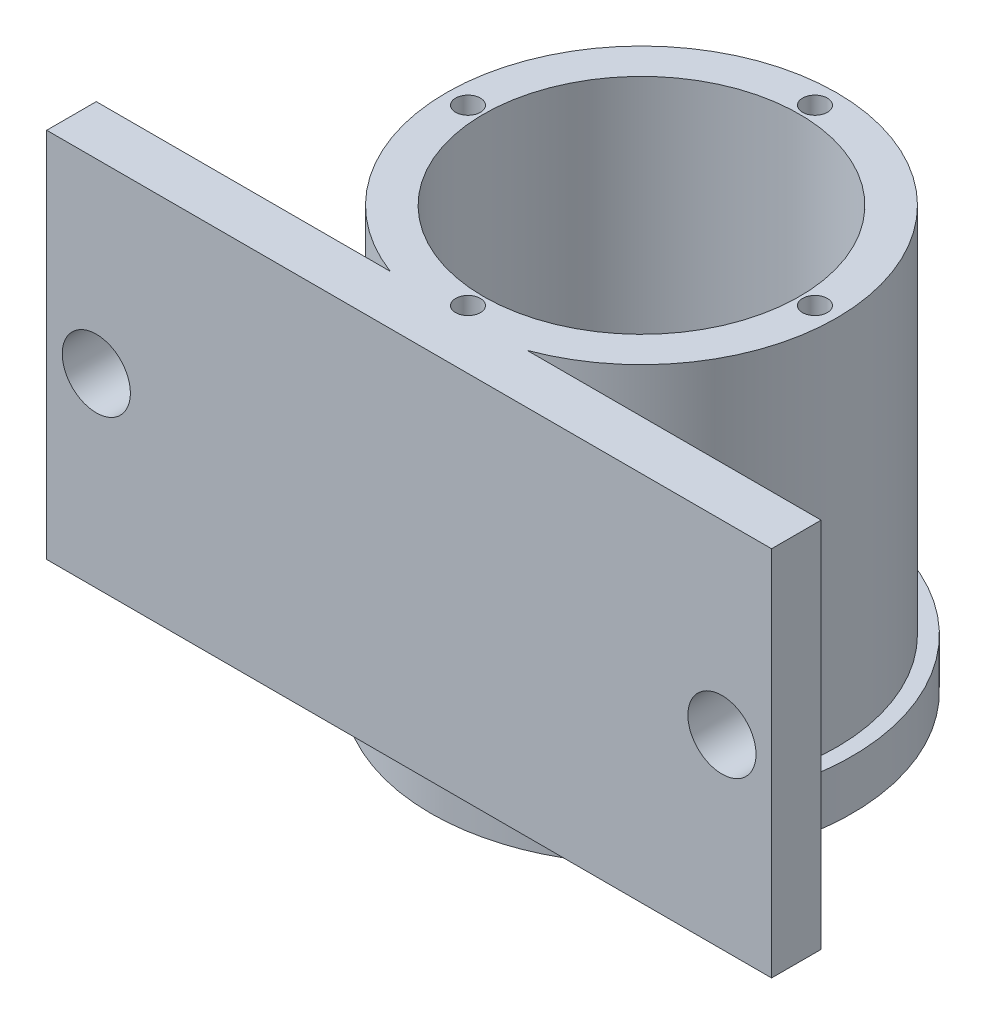
ISO-10303-21;
HEADER;
FILE_DESCRIPTION(('STEP AP214'),'2;1');
FILE_NAME('part.step','',(''),(''),'','','');
FILE_SCHEMA(('AUTOMOTIVE_DESIGN { 1 0 10303 214 1 1 1 1 }'));
ENDSEC;
DATA;
#1=APPLICATION_CONTEXT('core data for automotive mechanical design processes');
#2=APPLICATION_PROTOCOL_DEFINITION('international standard','automotive_design',2000,#1);
#3=PRODUCT_CONTEXT('',#1,'mechanical');
#4=PRODUCT('Part','Part','',(#3));
#5=PRODUCT_RELATED_PRODUCT_CATEGORY('part','',(#4));
#6=PRODUCT_DEFINITION_FORMATION('','',#4);
#7=PRODUCT_DEFINITION_CONTEXT('part definition',#1,'design');
#8=PRODUCT_DEFINITION('design','',#6,#7);
#9=PRODUCT_DEFINITION_SHAPE('','',#8);
#10=(LENGTH_UNIT() NAMED_UNIT(*) SI_UNIT(.MILLI.,.METRE.));
#11=(NAMED_UNIT(*) PLANE_ANGLE_UNIT() SI_UNIT($,.RADIAN.));
#12=(NAMED_UNIT(*) SI_UNIT($,.STERADIAN.) SOLID_ANGLE_UNIT());
#13=UNCERTAINTY_MEASURE_WITH_UNIT(LENGTH_MEASURE(1.E-05),#10,'distance_accuracy_value','');
#14=(GEOMETRIC_REPRESENTATION_CONTEXT(3) GLOBAL_UNCERTAINTY_ASSIGNED_CONTEXT((#13)) GLOBAL_UNIT_ASSIGNED_CONTEXT((#10,
#11,#12)) REPRESENTATION_CONTEXT('',''));
#15=CARTESIAN_POINT('',(0.,0.,0.));
#16=DIRECTION('',(0.,0.,1.));
#17=DIRECTION('',(1.,0.,0.));
#18=AXIS2_PLACEMENT_3D('',#15,#16,#17);
#19=CARTESIAN_POINT('',(0.,4.,0.));
#20=DIRECTION('',(0.,1.,0.));
#21=DIRECTION('',(0.,0.,1.));
#22=AXIS2_PLACEMENT_3D('',#19,#20,#21);
#23=PLANE('',#22);
#24=CARTESIAN_POINT('',(0.,4.,0.));
#25=DIRECTION('',(0.,1.,0.));
#26=DIRECTION('',(0.,0.,1.));
#27=AXIS2_PLACEMENT_3D('',#24,#25,#26);
#28=CIRCLE('',#27,17.);
#29=CARTESIAN_POINT('',(8.45207075218849,4.,14.75));
#30=VERTEX_POINT('',#29);
#31=CARTESIAN_POINT('',(-8.45207075218849,4.,14.75));
#32=VERTEX_POINT('',#31);
#33=EDGE_CURVE('E53',#30,#32,#28,.T.);
#34=ORIENTED_EDGE('',*,*,#33,.T.);
#35=DIRECTION('',(1.,0.,0.));
#36=VECTOR('',#35,1.);
#37=CARTESIAN_POINT('',(-29.2495226463702,4.,14.75));
#38=LINE('',#37,#36);
#39=CARTESIAN_POINT('',(-5.52268050859363,4.,14.75));
#40=VERTEX_POINT('',#39);
#41=EDGE_CURVE('E164',#32,#40,#38,.T.);
#42=ORIENTED_EDGE('',*,*,#41,.T.);
#43=CARTESIAN_POINT('',(0.,4.,0.));
#44=DIRECTION('',(0.,1.,0.));
#45=DIRECTION('',(0.,0.,1.));
#46=AXIS2_PLACEMENT_3D('',#43,#44,#45);
#47=CIRCLE('',#46,15.75);
#48=CARTESIAN_POINT('',(5.52268050859363,4.,14.75));
#49=VERTEX_POINT('',#48);
#50=EDGE_CURVE('E11',#49,#40,#47,.T.);
#51=ORIENTED_EDGE('',*,*,#50,.F.);
#52=EDGE_CURVE('E67',#49,#30,#38,.T.);
#53=ORIENTED_EDGE('',*,*,#52,.T.);
#54=EDGE_LOOP('',(#34,#42,#51,#53));
#55=FACE_BOUND('',#54,.T.);
#56=ADVANCED_FACE('F43',(#55),#23,.T.);
#57=CARTESIAN_POINT('',(0.,34.,0.));
#58=DIRECTION('',(0.,-1.,0.));
#59=DIRECTION('',(0.,0.,-1.));
#60=AXIS2_PLACEMENT_3D('',#57,#58,#59);
#61=CYLINDRICAL_SURFACE('',#60,15.75);
#62=DIRECTION('',(0.,-1.,0.));
#63=VECTOR('',#62,1.);
#64=CARTESIAN_POINT('',(-5.52268050859363,34.,14.75));
#65=LINE('',#64,#63);
#66=CARTESIAN_POINT('',(-5.52268050859363,34.,14.75));
#67=VERTEX_POINT('',#66);
#68=EDGE_CURVE('E177',#67,#40,#65,.T.);
#69=ORIENTED_EDGE('',*,*,#68,.F.);
#70=CARTESIAN_POINT('',(0.,34.,0.));
#71=DIRECTION('',(0.,1.,0.));
#72=DIRECTION('',(0.,0.,1.));
#73=AXIS2_PLACEMENT_3D('',#70,#71,#72);
#74=CIRCLE('',#73,15.75);
#75=CARTESIAN_POINT('',(5.52268050859363,34.,14.75));
#76=VERTEX_POINT('',#75);
#77=EDGE_CURVE('E191',#76,#67,#74,.T.);
#78=ORIENTED_EDGE('',*,*,#77,.F.);
#79=DIRECTION('',(0.,-1.,0.));
#80=VECTOR('',#79,1.);
#81=CARTESIAN_POINT('',(5.52268050859363,34.,14.75));
#82=LINE('',#81,#80);
#83=EDGE_CURVE('E168',#49,#76,#82,.F.);
#84=ORIENTED_EDGE('',*,*,#83,.F.);
#85=ORIENTED_EDGE('',*,*,#50,.T.);
#86=EDGE_LOOP('',(#69,#78,#84,#85));
#87=FACE_BOUND('',#86,.T.);
#88=ADVANCED_FACE('F219',(#87),#61,.T.);
#89=CARTESIAN_POINT('',(0.,4.,0.));
#90=DIRECTION('',(0.,-1.,0.));
#91=DIRECTION('',(0.,0.,-1.));
#92=AXIS2_PLACEMENT_3D('',#89,#90,#91);
#93=CYLINDRICAL_SURFACE('',#92,17.);
#94=ORIENTED_EDGE('',*,*,#33,.F.);
#95=CARTESIAN_POINT('',(0.,4.,0.));
#96=DIRECTION('',(0.,-1.,0.));
#97=DIRECTION('',(0.,0.,-1.));
#98=AXIS2_PLACEMENT_3D('',#95,#96,#97);
#99=CIRCLE('',#98,17.);
#100=EDGE_CURVE('E60',#30,#32,#99,.T.);
#101=ORIENTED_EDGE('',*,*,#100,.T.);
#102=EDGE_LOOP('',(#94,#101));
#103=FACE_BOUND('',#102,.T.);
#104=CARTESIAN_POINT('',(0.,0.,0.));
#105=DIRECTION('',(0.,1.,0.));
#106=DIRECTION('',(0.,0.,1.));
#107=AXIS2_PLACEMENT_3D('',#104,#105,#106);
#108=CIRCLE('',#107,17.);
#109=CARTESIAN_POINT('',(0.,0.,17.));
#110=VERTEX_POINT('',#109);
#111=EDGE_CURVE('E47',#110,#110,#108,.T.);
#112=ORIENTED_EDGE('',*,*,#111,.T.);
#113=EDGE_LOOP('',(#112));
#114=FACE_BOUND('',#113,.T.);
#115=ADVANCED_FACE('F45',(#103,#114),#93,.T.);
#116=CARTESIAN_POINT('',(0.,0.,0.));
#117=DIRECTION('',(0.,1.,0.));
#118=DIRECTION('',(0.,0.,1.));
#119=AXIS2_PLACEMENT_3D('',#116,#117,#118);
#120=PLANE('',#119);
#121=CARTESIAN_POINT('',(0.,0.,0.));
#122=DIRECTION('',(0.,1.,0.));
#123=DIRECTION('',(0.,0.,1.));
#124=AXIS2_PLACEMENT_3D('',#121,#122,#123);
#125=CIRCLE('',#124,15.);
#126=CARTESIAN_POINT('',(0.,0.,15.));
#127=VERTEX_POINT('',#126);
#128=EDGE_CURVE('E193',#127,#127,#125,.T.);
#129=ORIENTED_EDGE('',*,*,#128,.T.);
#130=EDGE_LOOP('',(#129));
#131=FACE_BOUND('',#130,.T.);
#132=ORIENTED_EDGE('',*,*,#111,.F.);
#133=EDGE_LOOP('',(#132));
#134=FACE_BOUND('',#133,.T.);
#135=ADVANCED_FACE('F208',(#131,#134),#120,.F.);
#136=CARTESIAN_POINT('',(0.,4.,0.));
#137=DIRECTION('',(0.,-1.,0.));
#138=DIRECTION('',(0.,0.,-1.));
#139=AXIS2_PLACEMENT_3D('',#136,#137,#138);
#140=CYLINDRICAL_SURFACE('',#139,15.);
#141=CARTESIAN_POINT('',(0.,2.,0.));
#142=DIRECTION('',(0.,1.,0.));
#143=DIRECTION('',(0.,0.,1.));
#144=AXIS2_PLACEMENT_3D('',#141,#142,#143);
#145=CIRCLE('',#144,15.);
#146=CARTESIAN_POINT('',(0.,2.,15.));
#147=VERTEX_POINT('',#146);
#148=EDGE_CURVE('E195',#147,#147,#145,.T.);
#149=ORIENTED_EDGE('',*,*,#148,.T.);
#150=EDGE_LOOP('',(#149));
#151=FACE_BOUND('',#150,.T.);
#152=ORIENTED_EDGE('',*,*,#128,.F.);
#153=EDGE_LOOP('',(#152));
#154=FACE_BOUND('',#153,.T.);
#155=ADVANCED_FACE('F210',(#151,#154),#140,.F.);
#156=CARTESIAN_POINT('',(0.,2.,0.));
#157=DIRECTION('',(0.,1.,0.));
#158=DIRECTION('',(0.,0.,1.));
#159=AXIS2_PLACEMENT_3D('',#156,#157,#158);
#160=PLANE('',#159);
#161=ORIENTED_EDGE('',*,*,#148,.F.);
#162=EDGE_LOOP('',(#161));
#163=FACE_BOUND('',#162,.T.);
#164=ADVANCED_FACE('F216',(#163),#160,.F.);
#165=CARTESIAN_POINT('',(0.,34.,0.));
#166=DIRECTION('',(0.,1.,0.));
#167=DIRECTION('',(0.,0.,1.));
#168=AXIS2_PLACEMENT_3D('',#165,#166,#167);
#169=PLANE('',#168);
#170=CARTESIAN_POINT('',(0.,34.,-14.));
#171=DIRECTION('',(0.,1.,0.));
#172=DIRECTION('',(0.,0.,1.));
#173=AXIS2_PLACEMENT_3D('',#170,#171,#172);
#174=CIRCLE('',#173,1.);
#175=CARTESIAN_POINT('',(0.,34.,-13.));
#176=VERTEX_POINT('',#175);
#177=EDGE_CURVE('E306',#176,#176,#174,.T.);
#178=ORIENTED_EDGE('',*,*,#177,.F.);
#179=EDGE_LOOP('',(#178));
#180=FACE_BOUND('',#179,.T.);
#181=CARTESIAN_POINT('',(14.0000000000004,34.,-3.95332173747447E-13));
#182=DIRECTION('',(0.,1.,0.));
#183=DIRECTION('',(0.,0.,1.));
#184=AXIS2_PLACEMENT_3D('',#181,#182,#183);
#185=CIRCLE('',#184,1.00000000000031);
#186=CARTESIAN_POINT('',(14.0000000000004,34.,0.999999999999914));
#187=VERTEX_POINT('',#186);
#188=EDGE_CURVE('E314',#187,#187,#185,.T.);
#189=ORIENTED_EDGE('',*,*,#188,.F.);
#190=EDGE_LOOP('',(#189));
#191=FACE_BOUND('',#190,.T.);
#192=CARTESIAN_POINT('',(7.90664347494893E-13,34.,14.));
#193=DIRECTION('',(0.,1.,0.));
#194=DIRECTION('',(0.,0.,1.));
#195=AXIS2_PLACEMENT_3D('',#192,#193,#194);
#196=CIRCLE('',#195,1.00000000000085);
#197=CARTESIAN_POINT('',(7.90664347494893E-13,34.,15.0000000000008));
#198=VERTEX_POINT('',#197);
#199=EDGE_CURVE('E324',#198,#198,#196,.T.);
#200=ORIENTED_EDGE('',*,*,#199,.F.);
#201=EDGE_LOOP('',(#200));
#202=FACE_BOUND('',#201,.T.);
#203=CARTESIAN_POINT('',(-13.9999999999996,34.,3.97046679266253E-13));
#204=DIRECTION('',(0.,1.,0.));
#205=DIRECTION('',(0.,0.,1.));
#206=AXIS2_PLACEMENT_3D('',#203,#204,#205);
#207=CIRCLE('',#206,1.00000000000064);
#208=CARTESIAN_POINT('',(-13.9999999999996,34.,1.00000000000103));
#209=VERTEX_POINT('',#208);
#210=EDGE_CURVE('E332',#209,#209,#207,.T.);
#211=ORIENTED_EDGE('',*,*,#210,.F.);
#212=EDGE_LOOP('',(#211));
#213=FACE_BOUND('',#212,.T.);
#214=ORIENTED_EDGE('',*,*,#77,.T.);
#215=DIRECTION('',(-1.,0.,0.));
#216=VECTOR('',#215,1.);
#217=CARTESIAN_POINT('',(-29.2495226463702,34.,14.75));
#218=LINE('',#217,#216);
#219=CARTESIAN_POINT('',(-29.2495226463702,34.,14.75));
#220=VERTEX_POINT('',#219);
#221=EDGE_CURVE('E152',#67,#220,#218,.T.);
#222=ORIENTED_EDGE('',*,*,#221,.T.);
#223=DIRECTION('',(0.,0.,1.));
#224=VECTOR('',#223,1.);
#225=CARTESIAN_POINT('',(-29.2495226463702,34.,14.75));
#226=LINE('',#225,#224);
#227=CARTESIAN_POINT('',(-29.2495226463702,34.,18.75));
#228=VERTEX_POINT('',#227);
#229=EDGE_CURVE('E118',#220,#228,#226,.T.);
#230=ORIENTED_EDGE('',*,*,#229,.T.);
#231=DIRECTION('',(-1.,0.,0.));
#232=VECTOR('',#231,1.);
#233=CARTESIAN_POINT('',(-29.2495226463702,34.,18.75));
#234=LINE('',#233,#232);
#235=CARTESIAN_POINT('',(29.2495226463702,34.,18.75));
#236=VERTEX_POINT('',#235);
#237=EDGE_CURVE('E122',#236,#228,#234,.T.);
#238=ORIENTED_EDGE('',*,*,#237,.F.);
#239=DIRECTION('',(0.,0.,1.));
#240=VECTOR('',#239,1.);
#241=CARTESIAN_POINT('',(29.2495226463702,34.,14.75));
#242=LINE('',#241,#240);
#243=CARTESIAN_POINT('',(29.2495226463702,34.,14.75));
#244=VERTEX_POINT('',#243);
#245=EDGE_CURVE('E106',#244,#236,#242,.T.);
#246=ORIENTED_EDGE('',*,*,#245,.F.);
#247=EDGE_CURVE('E153',#244,#76,#218,.T.);
#248=ORIENTED_EDGE('',*,*,#247,.T.);
#249=EDGE_LOOP('',(#214,#222,#230,#238,#246,#248));
#250=FACE_BOUND('',#249,.T.);
#251=CARTESIAN_POINT('',(0.,34.,0.));
#252=DIRECTION('',(0.,1.,0.));
#253=DIRECTION('',(0.,0.,1.));
#254=AXIS2_PLACEMENT_3D('',#251,#252,#253);
#255=CIRCLE('',#254,12.75);
#256=CARTESIAN_POINT('',(0.,34.,12.75));
#257=VERTEX_POINT('',#256);
#258=EDGE_CURVE('E183',#257,#257,#255,.T.);
#259=ORIENTED_EDGE('',*,*,#258,.F.);
#260=EDGE_LOOP('',(#259));
#261=FACE_BOUND('',#260,.T.);
#262=ADVANCED_FACE('F124',(#180,#191,#202,#213,#250,#261),#169,.T.);
#263=CARTESIAN_POINT('',(0.,34.,0.));
#264=DIRECTION('',(0.,-1.,0.));
#265=DIRECTION('',(0.,0.,-1.));
#266=AXIS2_PLACEMENT_3D('',#263,#264,#265);
#267=CYLINDRICAL_SURFACE('',#266,12.75);
#268=ORIENTED_EDGE('',*,*,#258,.T.);
#269=EDGE_LOOP('',(#268));
#270=FACE_BOUND('',#269,.T.);
#271=CARTESIAN_POINT('',(0.,5.,0.));
#272=DIRECTION('',(0.,1.,0.));
#273=DIRECTION('',(0.,0.,1.));
#274=AXIS2_PLACEMENT_3D('',#271,#272,#273);
#275=CIRCLE('',#274,12.75);
#276=CARTESIAN_POINT('',(0.,5.,12.75));
#277=VERTEX_POINT('',#276);
#278=EDGE_CURVE('E187',#277,#277,#275,.T.);
#279=ORIENTED_EDGE('',*,*,#278,.F.);
#280=EDGE_LOOP('',(#279));
#281=FACE_BOUND('',#280,.T.);
#282=ADVANCED_FACE('F233',(#270,#281),#267,.F.);
#283=CARTESIAN_POINT('',(0.,5.,0.));
#284=DIRECTION('',(0.,1.,0.));
#285=DIRECTION('',(0.,0.,1.));
#286=AXIS2_PLACEMENT_3D('',#283,#284,#285);
#287=PLANE('',#286);
#288=ORIENTED_EDGE('',*,*,#278,.T.);
#289=EDGE_LOOP('',(#288));
#290=FACE_BOUND('',#289,.T.);
#291=ADVANCED_FACE('F237',(#290),#287,.T.);
#292=CARTESIAN_POINT('',(0.,0.,14.75));
#293=DIRECTION('',(0.,0.,1.));
#294=DIRECTION('',(1.,0.,0.));
#295=AXIS2_PLACEMENT_3D('',#292,#293,#294);
#296=PLANE('',#295);
#297=CARTESIAN_POINT('',(-25.2446739434826,19.,14.75));
#298=DIRECTION('',(0.,0.,1.));
#299=DIRECTION('',(1.,0.,0.));
#300=AXIS2_PLACEMENT_3D('',#297,#298,#299);
#301=CIRCLE('',#300,2.75);
#302=CARTESIAN_POINT('',(-22.4946739434826,19.,14.75));
#303=VERTEX_POINT('',#302);
#304=EDGE_CURVE('E138',#303,#303,#301,.T.);
#305=ORIENTED_EDGE('',*,*,#304,.T.);
#306=EDGE_LOOP('',(#305));
#307=FACE_BOUND('',#306,.T.);
#308=ORIENTED_EDGE('',*,*,#221,.F.);
#309=ORIENTED_EDGE('',*,*,#68,.T.);
#310=ORIENTED_EDGE('',*,*,#41,.F.);
#311=CARTESIAN_POINT('',(-29.2495226463702,4.,14.75));
#312=VERTEX_POINT('',#311);
#313=EDGE_CURVE('E119',#312,#32,#38,.T.);
#314=ORIENTED_EDGE('',*,*,#313,.F.);
#315=DIRECTION('',(0.,-1.,0.));
#316=VECTOR('',#315,1.);
#317=CARTESIAN_POINT('',(-29.2495226463702,34.,14.75));
#318=LINE('',#317,#316);
#319=EDGE_CURVE('E156',#220,#312,#318,.T.);
#320=ORIENTED_EDGE('',*,*,#319,.F.);
#321=EDGE_LOOP('',(#308,#309,#310,#314,#320));
#322=FACE_BOUND('',#321,.T.);
#323=ADVANCED_FACE('F241',(#307,#322),#296,.F.);
#324=CARTESIAN_POINT('',(25.2446739434826,19.,14.75));
#325=DIRECTION('',(0.,0.,1.));
#326=DIRECTION('',(1.,0.,0.));
#327=AXIS2_PLACEMENT_3D('',#324,#325,#326);
#328=CIRCLE('',#327,2.75);
#329=CARTESIAN_POINT('',(27.9946739434826,19.,14.75));
#330=VERTEX_POINT('',#329);
#331=EDGE_CURVE('E142',#330,#330,#328,.T.);
#332=ORIENTED_EDGE('',*,*,#331,.T.);
#333=EDGE_LOOP('',(#332));
#334=FACE_BOUND('',#333,.T.);
#335=ORIENTED_EDGE('',*,*,#52,.F.);
#336=ORIENTED_EDGE('',*,*,#83,.T.);
#337=ORIENTED_EDGE('',*,*,#247,.F.);
#338=DIRECTION('',(0.,1.,0.));
#339=VECTOR('',#338,1.);
#340=CARTESIAN_POINT('',(29.2495226463702,34.,14.75));
#341=LINE('',#340,#339);
#342=CARTESIAN_POINT('',(29.2495226463702,4.,14.75));
#343=VERTEX_POINT('',#342);
#344=EDGE_CURVE('E113',#343,#244,#341,.T.);
#345=ORIENTED_EDGE('',*,*,#344,.F.);
#346=EDGE_CURVE('E160',#30,#343,#38,.T.);
#347=ORIENTED_EDGE('',*,*,#346,.F.);
#348=EDGE_LOOP('',(#335,#336,#337,#345,#347));
#349=FACE_BOUND('',#348,.T.);
#350=ADVANCED_FACE('F246',(#334,#349),#296,.F.);
#351=CARTESIAN_POINT('',(29.2495226463702,34.,14.75));
#352=DIRECTION('',(1.,0.,0.));
#353=DIRECTION('',(0.,0.,-1.));
#354=AXIS2_PLACEMENT_3D('',#351,#352,#353);
#355=PLANE('',#354);
#356=ORIENTED_EDGE('',*,*,#245,.T.);
#357=DIRECTION('',(0.,1.,0.));
#358=VECTOR('',#357,1.);
#359=CARTESIAN_POINT('',(29.2495226463702,34.,18.75));
#360=LINE('',#359,#358);
#361=CARTESIAN_POINT('',(29.2495226463702,4.,18.75));
#362=VERTEX_POINT('',#361);
#363=EDGE_CURVE('E111',#362,#236,#360,.T.);
#364=ORIENTED_EDGE('',*,*,#363,.F.);
#365=DIRECTION('',(0.,0.,1.));
#366=VECTOR('',#365,1.);
#367=CARTESIAN_POINT('',(29.2495226463702,4.,14.75));
#368=LINE('',#367,#366);
#369=EDGE_CURVE('E165',#343,#362,#368,.T.);
#370=ORIENTED_EDGE('',*,*,#369,.F.);
#371=ORIENTED_EDGE('',*,*,#344,.T.);
#372=EDGE_LOOP('',(#356,#364,#370,#371));
#373=FACE_BOUND('',#372,.T.);
#374=ADVANCED_FACE('F108',(#373),#355,.T.);
#375=CARTESIAN_POINT('',(-29.2495226463702,4.,14.75));
#376=DIRECTION('',(0.,-1.,0.));
#377=DIRECTION('',(0.,0.,-1.));
#378=AXIS2_PLACEMENT_3D('',#375,#376,#377);
#379=PLANE('',#378);
#380=ORIENTED_EDGE('',*,*,#100,.F.);
#381=ORIENTED_EDGE('',*,*,#346,.T.);
#382=ORIENTED_EDGE('',*,*,#369,.T.);
#383=DIRECTION('',(1.,0.,0.));
#384=VECTOR('',#383,1.);
#385=CARTESIAN_POINT('',(-29.2495226463702,4.,18.75));
#386=LINE('',#385,#384);
#387=CARTESIAN_POINT('',(-29.2495226463702,4.,18.75));
#388=VERTEX_POINT('',#387);
#389=EDGE_CURVE('E136',#388,#362,#386,.T.);
#390=ORIENTED_EDGE('',*,*,#389,.F.);
#391=DIRECTION('',(0.,0.,1.));
#392=VECTOR('',#391,1.);
#393=CARTESIAN_POINT('',(-29.2495226463702,4.,14.75));
#394=LINE('',#393,#392);
#395=EDGE_CURVE('E169',#312,#388,#394,.T.);
#396=ORIENTED_EDGE('',*,*,#395,.F.);
#397=ORIENTED_EDGE('',*,*,#313,.T.);
#398=EDGE_LOOP('',(#380,#381,#382,#390,#396,#397));
#399=FACE_BOUND('',#398,.T.);
#400=ADVANCED_FACE('F245',(#399),#379,.T.);
#401=CARTESIAN_POINT('',(-29.2495226463702,34.,14.75));
#402=DIRECTION('',(-1.,0.,0.));
#403=DIRECTION('',(0.,0.,1.));
#404=AXIS2_PLACEMENT_3D('',#401,#402,#403);
#405=PLANE('',#404);
#406=ORIENTED_EDGE('',*,*,#395,.T.);
#407=DIRECTION('',(0.,-1.,0.));
#408=VECTOR('',#407,1.);
#409=CARTESIAN_POINT('',(-29.2495226463702,34.,18.75));
#410=LINE('',#409,#408);
#411=EDGE_CURVE('E131',#228,#388,#410,.T.);
#412=ORIENTED_EDGE('',*,*,#411,.F.);
#413=ORIENTED_EDGE('',*,*,#229,.F.);
#414=ORIENTED_EDGE('',*,*,#319,.T.);
#415=EDGE_LOOP('',(#406,#412,#413,#414));
#416=FACE_BOUND('',#415,.T.);
#417=ADVANCED_FACE('F247',(#416),#405,.T.);
#418=CARTESIAN_POINT('',(0.,0.,18.75));
#419=DIRECTION('',(0.,0.,1.));
#420=DIRECTION('',(1.,0.,0.));
#421=AXIS2_PLACEMENT_3D('',#418,#419,#420);
#422=PLANE('',#421);
#423=CARTESIAN_POINT('',(-25.2446739434826,19.,18.75));
#424=DIRECTION('',(0.,0.,1.));
#425=DIRECTION('',(1.,0.,0.));
#426=AXIS2_PLACEMENT_3D('',#423,#424,#425);
#427=CIRCLE('',#426,2.75);
#428=CARTESIAN_POINT('',(-22.4946739434826,19.,18.75));
#429=VERTEX_POINT('',#428);
#430=EDGE_CURVE('E311',#429,#429,#427,.T.);
#431=ORIENTED_EDGE('',*,*,#430,.F.);
#432=EDGE_LOOP('',(#431));
#433=FACE_BOUND('',#432,.T.);
#434=CARTESIAN_POINT('',(25.2446739434826,19.,18.75));
#435=DIRECTION('',(0.,0.,1.));
#436=DIRECTION('',(-1.,0.,0.));
#437=AXIS2_PLACEMENT_3D('',#434,#435,#436);
#438=CIRCLE('',#437,2.75);
#439=CARTESIAN_POINT('',(22.4946739434826,19.,18.75));
#440=VERTEX_POINT('',#439);
#441=EDGE_CURVE('E305',#440,#440,#438,.T.);
#442=ORIENTED_EDGE('',*,*,#441,.F.);
#443=EDGE_LOOP('',(#442));
#444=FACE_BOUND('',#443,.T.);
#445=ORIENTED_EDGE('',*,*,#363,.T.);
#446=ORIENTED_EDGE('',*,*,#237,.T.);
#447=ORIENTED_EDGE('',*,*,#411,.T.);
#448=ORIENTED_EDGE('',*,*,#389,.T.);
#449=EDGE_LOOP('',(#445,#446,#447,#448));
#450=FACE_BOUND('',#449,.T.);
#451=ADVANCED_FACE('F134',(#433,#444,#450),#422,.T.);
#452=CARTESIAN_POINT('',(25.2446739434826,19.,13.75));
#453=DIRECTION('',(0.,0.,1.));
#454=DIRECTION('',(1.,0.,0.));
#455=AXIS2_PLACEMENT_3D('',#452,#453,#454);
#456=CYLINDRICAL_SURFACE('',#455,2.75);
#457=ORIENTED_EDGE('',*,*,#441,.T.);
#458=EDGE_LOOP('',(#457));
#459=FACE_BOUND('',#458,.T.);
#460=ORIENTED_EDGE('',*,*,#331,.F.);
#461=EDGE_LOOP('',(#460));
#462=FACE_BOUND('',#461,.T.);
#463=ADVANCED_FACE('F259',(#459,#462),#456,.F.);
#464=CARTESIAN_POINT('',(-25.2446739434826,19.,13.75));
#465=DIRECTION('',(0.,0.,1.));
#466=DIRECTION('',(1.,0.,0.));
#467=AXIS2_PLACEMENT_3D('',#464,#465,#466);
#468=CYLINDRICAL_SURFACE('',#467,2.75);
#469=ORIENTED_EDGE('',*,*,#430,.T.);
#470=EDGE_LOOP('',(#469));
#471=FACE_BOUND('',#470,.T.);
#472=ORIENTED_EDGE('',*,*,#304,.F.);
#473=EDGE_LOOP('',(#472));
#474=FACE_BOUND('',#473,.T.);
#475=ADVANCED_FACE('F263',(#471,#474),#468,.F.);
#476=CARTESIAN_POINT('',(-13.9999999999996,27.,3.97046679266253E-13));
#477=DIRECTION('',(0.,1.,0.));
#478=DIRECTION('',(0.,0.,1.));
#479=AXIS2_PLACEMENT_3D('',#476,#477,#478);
#480=CYLINDRICAL_SURFACE('',#479,1.00000000000064);
#481=CARTESIAN_POINT('',(-13.9999999999996,27.,3.97046679266253E-13));
#482=DIRECTION('',(0.,1.,0.));
#483=DIRECTION('',(0.,0.,1.));
#484=AXIS2_PLACEMENT_3D('',#481,#482,#483);
#485=CIRCLE('',#484,1.00000000000064);
#486=CARTESIAN_POINT('',(-13.9999999999996,27.,1.00000000000103));
#487=VERTEX_POINT('',#486);
#488=EDGE_CURVE('E336',#487,#487,#485,.T.);
#489=ORIENTED_EDGE('',*,*,#488,.F.);
#490=EDGE_LOOP('',(#489));
#491=FACE_BOUND('',#490,.T.);
#492=ORIENTED_EDGE('',*,*,#210,.T.);
#493=EDGE_LOOP('',(#492));
#494=FACE_BOUND('',#493,.T.);
#495=ADVANCED_FACE('F267',(#491,#494),#480,.F.);
#496=CARTESIAN_POINT('',(-13.9999999999996,27.,3.97046679266253E-13));
#497=DIRECTION('',(0.,1.,0.));
#498=DIRECTION('',(0.,0.,1.));
#499=AXIS2_PLACEMENT_3D('',#496,#497,#498);
#500=PLANE('',#499);
#501=ORIENTED_EDGE('',*,*,#488,.T.);
#502=EDGE_LOOP('',(#501));
#503=FACE_BOUND('',#502,.T.);
#504=ADVANCED_FACE('F269',(#503),#500,.T.);
#505=CARTESIAN_POINT('',(7.90664347494893E-13,27.,14.));
#506=DIRECTION('',(0.,1.,0.));
#507=DIRECTION('',(0.,0.,1.));
#508=AXIS2_PLACEMENT_3D('',#505,#506,#507);
#509=CYLINDRICAL_SURFACE('',#508,1.00000000000085);
#510=CARTESIAN_POINT('',(7.90664347494893E-13,27.,14.));
#511=DIRECTION('',(0.,1.,0.));
#512=DIRECTION('',(0.,0.,1.));
#513=AXIS2_PLACEMENT_3D('',#510,#511,#512);
#514=CIRCLE('',#513,1.00000000000085);
#515=CARTESIAN_POINT('',(7.90664347494893E-13,27.,15.0000000000008));
#516=VERTEX_POINT('',#515);
#517=EDGE_CURVE('E328',#516,#516,#514,.T.);
#518=ORIENTED_EDGE('',*,*,#517,.F.);
#519=EDGE_LOOP('',(#518));
#520=FACE_BOUND('',#519,.T.);
#521=ORIENTED_EDGE('',*,*,#199,.T.);
#522=EDGE_LOOP('',(#521));
#523=FACE_BOUND('',#522,.T.);
#524=ADVANCED_FACE('F272',(#520,#523),#509,.F.);
#525=CARTESIAN_POINT('',(7.90664347494893E-13,27.,14.));
#526=DIRECTION('',(0.,1.,0.));
#527=DIRECTION('',(0.,0.,1.));
#528=AXIS2_PLACEMENT_3D('',#525,#526,#527);
#529=PLANE('',#528);
#530=ORIENTED_EDGE('',*,*,#517,.T.);
#531=EDGE_LOOP('',(#530));
#532=FACE_BOUND('',#531,.T.);
#533=ADVANCED_FACE('F277',(#532),#529,.T.);
#534=CARTESIAN_POINT('',(14.0000000000004,27.,-3.95332173747447E-13));
#535=DIRECTION('',(0.,1.,0.));
#536=DIRECTION('',(0.,0.,1.));
#537=AXIS2_PLACEMENT_3D('',#534,#535,#536);
#538=CYLINDRICAL_SURFACE('',#537,1.00000000000031);
#539=CARTESIAN_POINT('',(14.0000000000004,27.,-3.95332173747447E-13));
#540=DIRECTION('',(0.,1.,0.));
#541=DIRECTION('',(0.,0.,1.));
#542=AXIS2_PLACEMENT_3D('',#539,#540,#541);
#543=CIRCLE('',#542,1.00000000000031);
#544=CARTESIAN_POINT('',(14.0000000000004,27.,0.999999999999914));
#545=VERTEX_POINT('',#544);
#546=EDGE_CURVE('E320',#545,#545,#543,.T.);
#547=ORIENTED_EDGE('',*,*,#546,.F.);
#548=EDGE_LOOP('',(#547));
#549=FACE_BOUND('',#548,.T.);
#550=ORIENTED_EDGE('',*,*,#188,.T.);
#551=EDGE_LOOP('',(#550));
#552=FACE_BOUND('',#551,.T.);
#553=ADVANCED_FACE('F280',(#549,#552),#538,.F.);
#554=CARTESIAN_POINT('',(14.0000000000004,27.,-3.95332173747447E-13));
#555=DIRECTION('',(0.,1.,0.));
#556=DIRECTION('',(0.,0.,1.));
#557=AXIS2_PLACEMENT_3D('',#554,#555,#556);
#558=PLANE('',#557);
#559=ORIENTED_EDGE('',*,*,#546,.T.);
#560=EDGE_LOOP('',(#559));
#561=FACE_BOUND('',#560,.T.);
#562=ADVANCED_FACE('F285',(#561),#558,.T.);
#563=CARTESIAN_POINT('',(0.,27.,-14.));
#564=DIRECTION('',(0.,1.,0.));
#565=DIRECTION('',(0.,0.,1.));
#566=AXIS2_PLACEMENT_3D('',#563,#564,#565);
#567=CYLINDRICAL_SURFACE('',#566,1.);
#568=CARTESIAN_POINT('',(0.,27.,-14.));
#569=DIRECTION('',(0.,1.,0.));
#570=DIRECTION('',(0.,0.,1.));
#571=AXIS2_PLACEMENT_3D('',#568,#569,#570);
#572=CIRCLE('',#571,1.);
#573=CARTESIAN_POINT('',(0.,27.,-13.));
#574=VERTEX_POINT('',#573);
#575=EDGE_CURVE('E303',#574,#574,#572,.T.);
#576=ORIENTED_EDGE('',*,*,#575,.F.);
#577=EDGE_LOOP('',(#576));
#578=FACE_BOUND('',#577,.T.);
#579=ORIENTED_EDGE('',*,*,#177,.T.);
#580=EDGE_LOOP('',(#579));
#581=FACE_BOUND('',#580,.T.);
#582=ADVANCED_FACE('F288',(#578,#581),#567,.F.);
#583=CARTESIAN_POINT('',(0.,27.,-14.));
#584=DIRECTION('',(0.,1.,0.));
#585=DIRECTION('',(0.,0.,1.));
#586=AXIS2_PLACEMENT_3D('',#583,#584,#585);
#587=PLANE('',#586);
#588=ORIENTED_EDGE('',*,*,#575,.T.);
#589=EDGE_LOOP('',(#588));
#590=FACE_BOUND('',#589,.T.);
#591=ADVANCED_FACE('F295',(#590),#587,.T.);
#592=CLOSED_SHELL('',(#56,#88,#115,#135,#155,#164,#262,#282,#291,#323,#350,#374,#400,#417,#451,
#463,#475,#495,#504,#524,#533,#553,#562,#582,#591));
#593=MANIFOLD_SOLID_BREP('B2',#592);
#594=ADVANCED_BREP_SHAPE_REPRESENTATION('',(#18,#593),#14);
#595=SHAPE_DEFINITION_REPRESENTATION(#9,#594);
ENDSEC;
END-ISO-10303-21;
